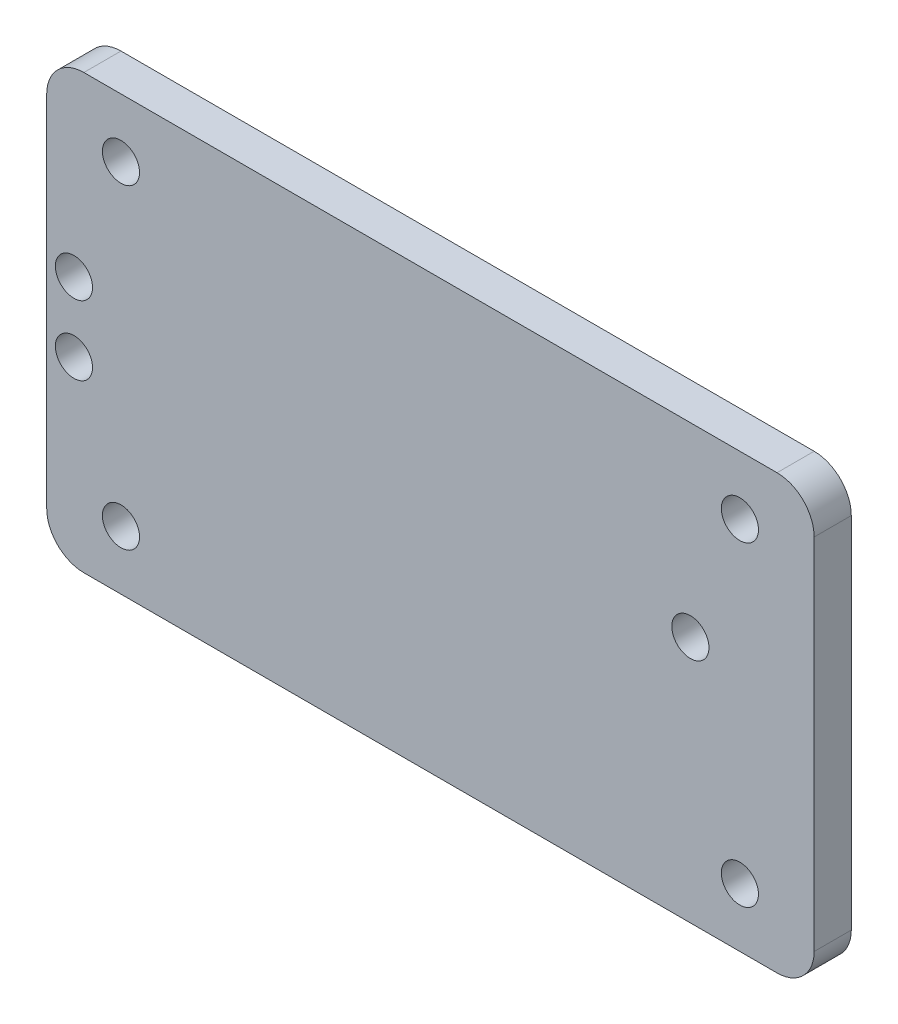
ISO-10303-21;
HEADER;
FILE_DESCRIPTION(('STEP AP214'),'2;1');
FILE_NAME('part.step','',(''),(''),'','','');
FILE_SCHEMA(('AUTOMOTIVE_DESIGN { 1 0 10303 214 1 1 1 1 }'));
ENDSEC;
DATA;
#1=APPLICATION_CONTEXT('core data for automotive mechanical design processes');
#2=APPLICATION_PROTOCOL_DEFINITION('international standard','automotive_design',2000,#1);
#3=PRODUCT_CONTEXT('',#1,'mechanical');
#4=PRODUCT('Part','Part','',(#3));
#5=PRODUCT_RELATED_PRODUCT_CATEGORY('part','',(#4));
#6=PRODUCT_DEFINITION_FORMATION('','',#4);
#7=PRODUCT_DEFINITION_CONTEXT('part definition',#1,'design');
#8=PRODUCT_DEFINITION('design','',#6,#7);
#9=PRODUCT_DEFINITION_SHAPE('','',#8);
#10=(LENGTH_UNIT() NAMED_UNIT(*) SI_UNIT(.MILLI.,.METRE.));
#11=(NAMED_UNIT(*) PLANE_ANGLE_UNIT() SI_UNIT($,.RADIAN.));
#12=(NAMED_UNIT(*) SI_UNIT($,.STERADIAN.) SOLID_ANGLE_UNIT());
#13=UNCERTAINTY_MEASURE_WITH_UNIT(LENGTH_MEASURE(1.E-05),#10,'distance_accuracy_value','');
#14=(GEOMETRIC_REPRESENTATION_CONTEXT(3) GLOBAL_UNCERTAINTY_ASSIGNED_CONTEXT((#13)) GLOBAL_UNIT_ASSIGNED_CONTEXT((#10,
#11,#12)) REPRESENTATION_CONTEXT('',''));
#15=CARTESIAN_POINT('',(0.,0.,0.));
#16=DIRECTION('',(0.,0.,1.));
#17=DIRECTION('',(1.,0.,0.));
#18=AXIS2_PLACEMENT_3D('',#15,#16,#17);
#19=CARTESIAN_POINT('',(28.,-14.5,3.));
#20=DIRECTION('',(0.,0.,1.));
#21=DIRECTION('',(1.,0.,0.));
#22=AXIS2_PLACEMENT_3D('',#19,#20,#21);
#23=PLANE('',#22);
#24=CARTESIAN_POINT('',(25.,-12.7500000000003,3.));
#25=DIRECTION('',(0.,0.,1.));
#26=DIRECTION('',(1.,0.,0.));
#27=AXIS2_PLACEMENT_3D('',#24,#25,#26);
#28=CIRCLE('',#27,1.5);
#29=CARTESIAN_POINT('',(26.5,-12.7500000000003,3.));
#30=VERTEX_POINT('',#29);
#31=EDGE_CURVE('E205',#30,#30,#28,.T.);
#32=ORIENTED_EDGE('',*,*,#31,.F.);
#33=EDGE_LOOP('',(#32));
#34=FACE_BOUND('',#33,.T.);
#35=CARTESIAN_POINT('',(-25.,12.7499999999997,3.));
#36=DIRECTION('',(0.,0.,1.));
#37=DIRECTION('',(1.,0.,0.));
#38=AXIS2_PLACEMENT_3D('',#35,#36,#37);
#39=CIRCLE('',#38,1.5);
#40=CARTESIAN_POINT('',(-23.5,12.7499999999997,3.));
#41=VERTEX_POINT('',#40);
#42=EDGE_CURVE('E193',#41,#41,#39,.T.);
#43=ORIENTED_EDGE('',*,*,#42,.F.);
#44=EDGE_LOOP('',(#43));
#45=FACE_BOUND('',#44,.T.);
#46=CARTESIAN_POINT('',(-28.8,-2.80000000000015,3.));
#47=DIRECTION('',(0.,0.,1.));
#48=DIRECTION('',(1.,0.,0.));
#49=AXIS2_PLACEMENT_3D('',#46,#47,#48);
#50=CIRCLE('',#49,1.5);
#51=CARTESIAN_POINT('',(-27.3,-2.80000000000015,3.));
#52=VERTEX_POINT('',#51);
#53=EDGE_CURVE('E181',#52,#52,#50,.T.);
#54=ORIENTED_EDGE('',*,*,#53,.F.);
#55=EDGE_LOOP('',(#54));
#56=FACE_BOUND('',#55,.T.);
#57=CARTESIAN_POINT('',(28.,-14.5,3.));
#58=DIRECTION('',(0.,0.,1.));
#59=DIRECTION('',(1.,0.,0.));
#60=AXIS2_PLACEMENT_3D('',#57,#58,#59);
#61=CIRCLE('',#60,3.);
#62=CARTESIAN_POINT('',(28.,-17.5,3.));
#63=VERTEX_POINT('',#62);
#64=CARTESIAN_POINT('',(31.,-14.5,3.));
#65=VERTEX_POINT('',#64);
#66=EDGE_CURVE('E144',#63,#65,#61,.T.);
#67=ORIENTED_EDGE('',*,*,#66,.T.);
#68=DIRECTION('',(0.,1.,0.));
#69=VECTOR('',#68,1.);
#70=CARTESIAN_POINT('',(31.,14.5,3.));
#71=LINE('',#70,#69);
#72=CARTESIAN_POINT('',(31.,14.5,3.));
#73=VERTEX_POINT('',#72);
#74=EDGE_CURVE('E92',#65,#73,#71,.T.);
#75=ORIENTED_EDGE('',*,*,#74,.T.);
#76=CARTESIAN_POINT('',(28.,14.5,3.));
#77=DIRECTION('',(0.,0.,1.));
#78=DIRECTION('',(-1.,0.,0.));
#79=AXIS2_PLACEMENT_3D('',#76,#77,#78);
#80=CIRCLE('',#79,3.);
#81=CARTESIAN_POINT('',(28.,17.5,3.));
#82=VERTEX_POINT('',#81);
#83=EDGE_CURVE('E159',#73,#82,#80,.T.);
#84=ORIENTED_EDGE('',*,*,#83,.T.);
#85=DIRECTION('',(-1.,0.,0.));
#86=VECTOR('',#85,1.);
#87=CARTESIAN_POINT('',(-28.,17.5,3.));
#88=LINE('',#87,#86);
#89=CARTESIAN_POINT('',(-28.,17.5,3.));
#90=VERTEX_POINT('',#89);
#91=EDGE_CURVE('E172',#82,#90,#88,.T.);
#92=ORIENTED_EDGE('',*,*,#91,.T.);
#93=CARTESIAN_POINT('',(-28.,14.5,3.));
#94=DIRECTION('',(0.,0.,1.));
#95=DIRECTION('',(1.,0.,0.));
#96=AXIS2_PLACEMENT_3D('',#93,#94,#95);
#97=CIRCLE('',#96,3.);
#98=CARTESIAN_POINT('',(-31.,14.5,3.));
#99=VERTEX_POINT('',#98);
#100=EDGE_CURVE('E111',#90,#99,#97,.T.);
#101=ORIENTED_EDGE('',*,*,#100,.T.);
#102=DIRECTION('',(0.,-1.,0.));
#103=VECTOR('',#102,1.);
#104=CARTESIAN_POINT('',(-31.,14.5,3.));
#105=LINE('',#104,#103);
#106=CARTESIAN_POINT('',(-31.,-14.5,3.));
#107=VERTEX_POINT('',#106);
#108=EDGE_CURVE('E105',#99,#107,#105,.T.);
#109=ORIENTED_EDGE('',*,*,#108,.T.);
#110=CARTESIAN_POINT('',(-28.,-14.5,3.));
#111=DIRECTION('',(0.,0.,1.));
#112=DIRECTION('',(1.,0.,0.));
#113=AXIS2_PLACEMENT_3D('',#110,#111,#112);
#114=CIRCLE('',#113,3.);
#115=CARTESIAN_POINT('',(-28.,-17.5,3.));
#116=VERTEX_POINT('',#115);
#117=EDGE_CURVE('E109',#107,#116,#114,.T.);
#118=ORIENTED_EDGE('',*,*,#117,.T.);
#119=DIRECTION('',(1.,0.,0.));
#120=VECTOR('',#119,1.);
#121=CARTESIAN_POINT('',(-28.,-17.5,3.));
#122=LINE('',#121,#120);
#123=EDGE_CURVE('E49',#116,#63,#122,.T.);
#124=ORIENTED_EDGE('',*,*,#123,.T.);
#125=EDGE_LOOP('',(#67,#75,#84,#92,#101,#109,#118,#124));
#126=FACE_BOUND('',#125,.T.);
#127=CARTESIAN_POINT('',(-28.8,2.79999999999985,3.));
#128=DIRECTION('',(0.,0.,1.));
#129=DIRECTION('',(1.,0.,0.));
#130=AXIS2_PLACEMENT_3D('',#127,#128,#129);
#131=CIRCLE('',#130,1.5);
#132=CARTESIAN_POINT('',(-27.3,2.79999999999985,3.));
#133=VERTEX_POINT('',#132);
#134=EDGE_CURVE('E133',#133,#133,#131,.T.);
#135=ORIENTED_EDGE('',*,*,#134,.F.);
#136=EDGE_LOOP('',(#135));
#137=FACE_BOUND('',#136,.T.);
#138=CARTESIAN_POINT('',(21.,2.49999999999985,3.));
#139=DIRECTION('',(0.,0.,1.));
#140=DIRECTION('',(1.,0.,0.));
#141=AXIS2_PLACEMENT_3D('',#138,#139,#140);
#142=CIRCLE('',#141,1.5);
#143=CARTESIAN_POINT('',(22.5,2.49999999999985,3.));
#144=VERTEX_POINT('',#143);
#145=EDGE_CURVE('E187',#144,#144,#142,.T.);
#146=ORIENTED_EDGE('',*,*,#145,.F.);
#147=EDGE_LOOP('',(#146));
#148=FACE_BOUND('',#147,.T.);
#149=CARTESIAN_POINT('',(25.,12.7499999999997,3.));
#150=DIRECTION('',(0.,0.,1.));
#151=DIRECTION('',(1.,0.,0.));
#152=AXIS2_PLACEMENT_3D('',#149,#150,#151);
#153=CIRCLE('',#152,1.5);
#154=CARTESIAN_POINT('',(26.5,12.7499999999997,3.));
#155=VERTEX_POINT('',#154);
#156=EDGE_CURVE('E199',#155,#155,#153,.T.);
#157=ORIENTED_EDGE('',*,*,#156,.F.);
#158=EDGE_LOOP('',(#157));
#159=FACE_BOUND('',#158,.T.);
#160=CARTESIAN_POINT('',(-25.,-12.7500000000003,3.));
#161=DIRECTION('',(0.,0.,1.));
#162=DIRECTION('',(1.,0.,0.));
#163=AXIS2_PLACEMENT_3D('',#160,#161,#162);
#164=CIRCLE('',#163,1.5);
#165=CARTESIAN_POINT('',(-23.5,-12.7500000000003,3.));
#166=VERTEX_POINT('',#165);
#167=EDGE_CURVE('E211',#166,#166,#164,.T.);
#168=ORIENTED_EDGE('',*,*,#167,.F.);
#169=EDGE_LOOP('',(#168));
#170=FACE_BOUND('',#169,.T.);
#171=ADVANCED_FACE('F32',(#34,#45,#56,#126,#137,#148,#159,#170),#23,.T.);
#172=CARTESIAN_POINT('',(28.,-14.5,0.));
#173=DIRECTION('',(0.,0.,1.));
#174=DIRECTION('',(1.,0.,0.));
#175=AXIS2_PLACEMENT_3D('',#172,#173,#174);
#176=PLANE('',#175);
#177=CARTESIAN_POINT('',(28.,-14.5,0.));
#178=DIRECTION('',(0.,0.,1.));
#179=DIRECTION('',(1.,0.,0.));
#180=AXIS2_PLACEMENT_3D('',#177,#178,#179);
#181=CIRCLE('',#180,3.);
#182=CARTESIAN_POINT('',(28.,-17.5,0.));
#183=VERTEX_POINT('',#182);
#184=CARTESIAN_POINT('',(31.,-14.5,0.));
#185=VERTEX_POINT('',#184);
#186=EDGE_CURVE('E129',#183,#185,#181,.T.);
#187=ORIENTED_EDGE('',*,*,#186,.F.);
#188=DIRECTION('',(1.,0.,0.));
#189=VECTOR('',#188,1.);
#190=CARTESIAN_POINT('',(-28.,-17.5,0.));
#191=LINE('',#190,#189);
#192=CARTESIAN_POINT('',(-28.,-17.5,0.));
#193=VERTEX_POINT('',#192);
#194=EDGE_CURVE('E84',#193,#183,#191,.T.);
#195=ORIENTED_EDGE('',*,*,#194,.F.);
#196=CARTESIAN_POINT('',(-28.,-14.5,0.));
#197=DIRECTION('',(0.,0.,1.));
#198=DIRECTION('',(1.,0.,0.));
#199=AXIS2_PLACEMENT_3D('',#196,#197,#198);
#200=CIRCLE('',#199,3.);
#201=CARTESIAN_POINT('',(-31.,-14.5,0.));
#202=VERTEX_POINT('',#201);
#203=EDGE_CURVE('E78',#202,#193,#200,.T.);
#204=ORIENTED_EDGE('',*,*,#203,.F.);
#205=DIRECTION('',(0.,-1.,0.));
#206=VECTOR('',#205,1.);
#207=CARTESIAN_POINT('',(-31.,14.5,0.));
#208=LINE('',#207,#206);
#209=CARTESIAN_POINT('',(-31.,14.5,0.));
#210=VERTEX_POINT('',#209);
#211=EDGE_CURVE('E119',#210,#202,#208,.T.);
#212=ORIENTED_EDGE('',*,*,#211,.F.);
#213=CARTESIAN_POINT('',(-28.,14.5,0.));
#214=DIRECTION('',(0.,0.,1.));
#215=DIRECTION('',(1.,0.,0.));
#216=AXIS2_PLACEMENT_3D('',#213,#214,#215);
#217=CIRCLE('',#216,3.);
#218=CARTESIAN_POINT('',(-28.,17.5,0.));
#219=VERTEX_POINT('',#218);
#220=EDGE_CURVE('E139',#219,#210,#217,.T.);
#221=ORIENTED_EDGE('',*,*,#220,.F.);
#222=DIRECTION('',(-1.,0.,0.));
#223=VECTOR('',#222,1.);
#224=CARTESIAN_POINT('',(-28.,17.5,0.));
#225=LINE('',#224,#223);
#226=CARTESIAN_POINT('',(28.,17.5,0.));
#227=VERTEX_POINT('',#226);
#228=EDGE_CURVE('E137',#227,#219,#225,.T.);
#229=ORIENTED_EDGE('',*,*,#228,.F.);
#230=CARTESIAN_POINT('',(28.,14.5,0.));
#231=DIRECTION('',(0.,0.,1.));
#232=DIRECTION('',(-1.,0.,0.));
#233=AXIS2_PLACEMENT_3D('',#230,#231,#232);
#234=CIRCLE('',#233,3.);
#235=CARTESIAN_POINT('',(31.,14.5,0.));
#236=VERTEX_POINT('',#235);
#237=EDGE_CURVE('E135',#236,#227,#234,.T.);
#238=ORIENTED_EDGE('',*,*,#237,.F.);
#239=DIRECTION('',(0.,1.,0.));
#240=VECTOR('',#239,1.);
#241=CARTESIAN_POINT('',(31.,14.5,0.));
#242=LINE('',#241,#240);
#243=EDGE_CURVE('E132',#185,#236,#242,.T.);
#244=ORIENTED_EDGE('',*,*,#243,.F.);
#245=EDGE_LOOP('',(#187,#195,#204,#212,#221,#229,#238,#244));
#246=FACE_BOUND('',#245,.T.);
#247=CARTESIAN_POINT('',(-28.8,2.79999999999985,0.));
#248=DIRECTION('',(0.,0.,1.));
#249=DIRECTION('',(1.,0.,0.));
#250=AXIS2_PLACEMENT_3D('',#247,#248,#249);
#251=CIRCLE('',#250,1.5);
#252=CARTESIAN_POINT('',(-27.3,2.79999999999985,0.));
#253=VERTEX_POINT('',#252);
#254=EDGE_CURVE('E178',#253,#253,#251,.T.);
#255=ORIENTED_EDGE('',*,*,#254,.T.);
#256=EDGE_LOOP('',(#255));
#257=FACE_BOUND('',#256,.T.);
#258=CARTESIAN_POINT('',(-28.8,-2.80000000000015,0.));
#259=DIRECTION('',(0.,0.,1.));
#260=DIRECTION('',(1.,0.,0.));
#261=AXIS2_PLACEMENT_3D('',#258,#259,#260);
#262=CIRCLE('',#261,1.5);
#263=CARTESIAN_POINT('',(-27.3,-2.80000000000015,0.));
#264=VERTEX_POINT('',#263);
#265=EDGE_CURVE('E184',#264,#264,#262,.T.);
#266=ORIENTED_EDGE('',*,*,#265,.T.);
#267=EDGE_LOOP('',(#266));
#268=FACE_BOUND('',#267,.T.);
#269=CARTESIAN_POINT('',(21.,2.49999999999985,0.));
#270=DIRECTION('',(0.,0.,1.));
#271=DIRECTION('',(1.,0.,0.));
#272=AXIS2_PLACEMENT_3D('',#269,#270,#271);
#273=CIRCLE('',#272,1.5);
#274=CARTESIAN_POINT('',(22.5,2.49999999999985,0.));
#275=VERTEX_POINT('',#274);
#276=EDGE_CURVE('E190',#275,#275,#273,.T.);
#277=ORIENTED_EDGE('',*,*,#276,.T.);
#278=EDGE_LOOP('',(#277));
#279=FACE_BOUND('',#278,.T.);
#280=CARTESIAN_POINT('',(-25.,12.7499999999997,0.));
#281=DIRECTION('',(0.,0.,1.));
#282=DIRECTION('',(1.,0.,0.));
#283=AXIS2_PLACEMENT_3D('',#280,#281,#282);
#284=CIRCLE('',#283,1.5);
#285=CARTESIAN_POINT('',(-23.5,12.7499999999997,0.));
#286=VERTEX_POINT('',#285);
#287=EDGE_CURVE('E196',#286,#286,#284,.T.);
#288=ORIENTED_EDGE('',*,*,#287,.T.);
#289=EDGE_LOOP('',(#288));
#290=FACE_BOUND('',#289,.T.);
#291=CARTESIAN_POINT('',(25.,12.7499999999997,0.));
#292=DIRECTION('',(0.,0.,1.));
#293=DIRECTION('',(1.,0.,0.));
#294=AXIS2_PLACEMENT_3D('',#291,#292,#293);
#295=CIRCLE('',#294,1.5);
#296=CARTESIAN_POINT('',(26.5,12.7499999999997,0.));
#297=VERTEX_POINT('',#296);
#298=EDGE_CURVE('E202',#297,#297,#295,.T.);
#299=ORIENTED_EDGE('',*,*,#298,.T.);
#300=EDGE_LOOP('',(#299));
#301=FACE_BOUND('',#300,.T.);
#302=CARTESIAN_POINT('',(25.,-12.7500000000003,0.));
#303=DIRECTION('',(0.,0.,1.));
#304=DIRECTION('',(1.,0.,0.));
#305=AXIS2_PLACEMENT_3D('',#302,#303,#304);
#306=CIRCLE('',#305,1.5);
#307=CARTESIAN_POINT('',(26.5,-12.7500000000003,0.));
#308=VERTEX_POINT('',#307);
#309=EDGE_CURVE('E208',#308,#308,#306,.T.);
#310=ORIENTED_EDGE('',*,*,#309,.T.);
#311=EDGE_LOOP('',(#310));
#312=FACE_BOUND('',#311,.T.);
#313=CARTESIAN_POINT('',(-25.,-12.7500000000003,0.));
#314=DIRECTION('',(0.,0.,1.));
#315=DIRECTION('',(1.,0.,0.));
#316=AXIS2_PLACEMENT_3D('',#313,#314,#315);
#317=CIRCLE('',#316,1.5);
#318=CARTESIAN_POINT('',(-23.5,-12.7500000000003,0.));
#319=VERTEX_POINT('',#318);
#320=EDGE_CURVE('E214',#319,#319,#317,.T.);
#321=ORIENTED_EDGE('',*,*,#320,.T.);
#322=EDGE_LOOP('',(#321));
#323=FACE_BOUND('',#322,.T.);
#324=ADVANCED_FACE('F163',(#246,#257,#268,#279,#290,#301,#312,#323),#176,.F.);
#325=CARTESIAN_POINT('',(28.,-14.5,3.));
#326=DIRECTION('',(0.,0.,-1.));
#327=DIRECTION('',(-1.,0.,0.));
#328=AXIS2_PLACEMENT_3D('',#325,#326,#327);
#329=CYLINDRICAL_SURFACE('',#328,3.);
#330=ORIENTED_EDGE('',*,*,#186,.T.);
#331=DIRECTION('',(0.,0.,-1.));
#332=VECTOR('',#331,1.);
#333=CARTESIAN_POINT('',(31.,-14.5,3.));
#334=LINE('',#333,#332);
#335=EDGE_CURVE('E11',#65,#185,#334,.T.);
#336=ORIENTED_EDGE('',*,*,#335,.F.);
#337=ORIENTED_EDGE('',*,*,#66,.F.);
#338=DIRECTION('',(0.,0.,-1.));
#339=VECTOR('',#338,1.);
#340=CARTESIAN_POINT('',(28.,-17.5,3.));
#341=LINE('',#340,#339);
#342=EDGE_CURVE('E125',#63,#183,#341,.T.);
#343=ORIENTED_EDGE('',*,*,#342,.T.);
#344=EDGE_LOOP('',(#330,#336,#337,#343));
#345=FACE_BOUND('',#344,.T.);
#346=ADVANCED_FACE('F34',(#345),#329,.T.);
#347=CARTESIAN_POINT('',(31.,14.5,3.));
#348=DIRECTION('',(-1.,0.,0.));
#349=DIRECTION('',(0.,0.,1.));
#350=AXIS2_PLACEMENT_3D('',#347,#348,#349);
#351=PLANE('',#350);
#352=ORIENTED_EDGE('',*,*,#243,.T.);
#353=DIRECTION('',(0.,0.,-1.));
#354=VECTOR('',#353,1.);
#355=CARTESIAN_POINT('',(31.,14.5,3.));
#356=LINE('',#355,#354);
#357=EDGE_CURVE('E41',#73,#236,#356,.T.);
#358=ORIENTED_EDGE('',*,*,#357,.F.);
#359=ORIENTED_EDGE('',*,*,#74,.F.);
#360=ORIENTED_EDGE('',*,*,#335,.T.);
#361=EDGE_LOOP('',(#352,#358,#359,#360));
#362=FACE_BOUND('',#361,.T.);
#363=ADVANCED_FACE('F248',(#362),#351,.F.);
#364=CARTESIAN_POINT('',(28.,14.5,3.));
#365=DIRECTION('',(0.,0.,-1.));
#366=DIRECTION('',(-1.,0.,0.));
#367=AXIS2_PLACEMENT_3D('',#364,#365,#366);
#368=CYLINDRICAL_SURFACE('',#367,3.);
#369=ORIENTED_EDGE('',*,*,#237,.T.);
#370=DIRECTION('',(0.,0.,-1.));
#371=VECTOR('',#370,1.);
#372=CARTESIAN_POINT('',(28.,17.5,3.));
#373=LINE('',#372,#371);
#374=EDGE_CURVE('E151',#82,#227,#373,.T.);
#375=ORIENTED_EDGE('',*,*,#374,.F.);
#376=ORIENTED_EDGE('',*,*,#83,.F.);
#377=ORIENTED_EDGE('',*,*,#357,.T.);
#378=EDGE_LOOP('',(#369,#375,#376,#377));
#379=FACE_BOUND('',#378,.T.);
#380=ADVANCED_FACE('F157',(#379),#368,.T.);
#381=CARTESIAN_POINT('',(-28.,17.5,3.));
#382=DIRECTION('',(0.,-1.,0.));
#383=DIRECTION('',(0.,0.,-1.));
#384=AXIS2_PLACEMENT_3D('',#381,#382,#383);
#385=PLANE('',#384);
#386=ORIENTED_EDGE('',*,*,#228,.T.);
#387=DIRECTION('',(0.,0.,-1.));
#388=VECTOR('',#387,1.);
#389=CARTESIAN_POINT('',(-28.,17.5,3.));
#390=LINE('',#389,#388);
#391=EDGE_CURVE('E148',#90,#219,#390,.T.);
#392=ORIENTED_EDGE('',*,*,#391,.F.);
#393=ORIENTED_EDGE('',*,*,#91,.F.);
#394=ORIENTED_EDGE('',*,*,#374,.T.);
#395=EDGE_LOOP('',(#386,#392,#393,#394));
#396=FACE_BOUND('',#395,.T.);
#397=ADVANCED_FACE('F168',(#396),#385,.F.);
#398=CARTESIAN_POINT('',(-28.,14.5,3.));
#399=DIRECTION('',(0.,0.,-1.));
#400=DIRECTION('',(-1.,0.,0.));
#401=AXIS2_PLACEMENT_3D('',#398,#399,#400);
#402=CYLINDRICAL_SURFACE('',#401,3.);
#403=ORIENTED_EDGE('',*,*,#220,.T.);
#404=DIRECTION('',(0.,0.,-1.));
#405=VECTOR('',#404,1.);
#406=CARTESIAN_POINT('',(-31.,14.5,3.));
#407=LINE('',#406,#405);
#408=EDGE_CURVE('E120',#99,#210,#407,.T.);
#409=ORIENTED_EDGE('',*,*,#408,.F.);
#410=ORIENTED_EDGE('',*,*,#100,.F.);
#411=ORIENTED_EDGE('',*,*,#391,.T.);
#412=EDGE_LOOP('',(#403,#409,#410,#411));
#413=FACE_BOUND('',#412,.T.);
#414=ADVANCED_FACE('F171',(#413),#402,.T.);
#415=CARTESIAN_POINT('',(-31.,14.5,3.));
#416=DIRECTION('',(1.,0.,0.));
#417=DIRECTION('',(0.,0.,-1.));
#418=AXIS2_PLACEMENT_3D('',#415,#416,#417);
#419=PLANE('',#418);
#420=ORIENTED_EDGE('',*,*,#211,.T.);
#421=DIRECTION('',(0.,0.,-1.));
#422=VECTOR('',#421,1.);
#423=CARTESIAN_POINT('',(-31.,-14.5,3.));
#424=LINE('',#423,#422);
#425=EDGE_CURVE('E116',#107,#202,#424,.T.);
#426=ORIENTED_EDGE('',*,*,#425,.F.);
#427=ORIENTED_EDGE('',*,*,#108,.F.);
#428=ORIENTED_EDGE('',*,*,#408,.T.);
#429=EDGE_LOOP('',(#420,#426,#427,#428));
#430=FACE_BOUND('',#429,.T.);
#431=ADVANCED_FACE('F117',(#430),#419,.F.);
#432=CARTESIAN_POINT('',(-28.,-14.5,3.));
#433=DIRECTION('',(0.,0.,-1.));
#434=DIRECTION('',(-1.,0.,0.));
#435=AXIS2_PLACEMENT_3D('',#432,#433,#434);
#436=CYLINDRICAL_SURFACE('',#435,3.);
#437=ORIENTED_EDGE('',*,*,#203,.T.);
#438=DIRECTION('',(0.,0.,-1.));
#439=VECTOR('',#438,1.);
#440=CARTESIAN_POINT('',(-28.,-17.5,3.));
#441=LINE('',#440,#439);
#442=EDGE_CURVE('E121',#116,#193,#441,.T.);
#443=ORIENTED_EDGE('',*,*,#442,.F.);
#444=ORIENTED_EDGE('',*,*,#117,.F.);
#445=ORIENTED_EDGE('',*,*,#425,.T.);
#446=EDGE_LOOP('',(#437,#443,#444,#445));
#447=FACE_BOUND('',#446,.T.);
#448=ADVANCED_FACE('F123',(#447),#436,.T.);
#449=CARTESIAN_POINT('',(-28.,-17.5,3.));
#450=DIRECTION('',(0.,1.,0.));
#451=DIRECTION('',(0.,0.,1.));
#452=AXIS2_PLACEMENT_3D('',#449,#450,#451);
#453=PLANE('',#452);
#454=ORIENTED_EDGE('',*,*,#194,.T.);
#455=ORIENTED_EDGE('',*,*,#342,.F.);
#456=ORIENTED_EDGE('',*,*,#123,.F.);
#457=ORIENTED_EDGE('',*,*,#442,.T.);
#458=EDGE_LOOP('',(#454,#455,#456,#457));
#459=FACE_BOUND('',#458,.T.);
#460=ADVANCED_FACE('F236',(#459),#453,.F.);
#461=CARTESIAN_POINT('',(-28.8,2.79999999999985,3.));
#462=DIRECTION('',(0.,0.,-1.));
#463=DIRECTION('',(-1.,0.,0.));
#464=AXIS2_PLACEMENT_3D('',#461,#462,#463);
#465=CYLINDRICAL_SURFACE('',#464,1.5);
#466=ORIENTED_EDGE('',*,*,#134,.T.);
#467=EDGE_LOOP('',(#466));
#468=FACE_BOUND('',#467,.T.);
#469=ORIENTED_EDGE('',*,*,#254,.F.);
#470=EDGE_LOOP('',(#469));
#471=FACE_BOUND('',#470,.T.);
#472=ADVANCED_FACE('F233',(#468,#471),#465,.F.);
#473=CARTESIAN_POINT('',(-28.8,-2.80000000000015,3.));
#474=DIRECTION('',(0.,0.,-1.));
#475=DIRECTION('',(-1.,0.,0.));
#476=AXIS2_PLACEMENT_3D('',#473,#474,#475);
#477=CYLINDRICAL_SURFACE('',#476,1.5);
#478=ORIENTED_EDGE('',*,*,#53,.T.);
#479=EDGE_LOOP('',(#478));
#480=FACE_BOUND('',#479,.T.);
#481=ORIENTED_EDGE('',*,*,#265,.F.);
#482=EDGE_LOOP('',(#481));
#483=FACE_BOUND('',#482,.T.);
#484=ADVANCED_FACE('F312',(#480,#483),#477,.F.);
#485=CARTESIAN_POINT('',(21.,2.49999999999985,3.));
#486=DIRECTION('',(0.,0.,-1.));
#487=DIRECTION('',(-1.,0.,0.));
#488=AXIS2_PLACEMENT_3D('',#485,#486,#487);
#489=CYLINDRICAL_SURFACE('',#488,1.5);
#490=ORIENTED_EDGE('',*,*,#145,.T.);
#491=EDGE_LOOP('',(#490));
#492=FACE_BOUND('',#491,.T.);
#493=ORIENTED_EDGE('',*,*,#276,.F.);
#494=EDGE_LOOP('',(#493));
#495=FACE_BOUND('',#494,.T.);
#496=ADVANCED_FACE('F320',(#492,#495),#489,.F.);
#497=CARTESIAN_POINT('',(-25.,12.7499999999997,3.));
#498=DIRECTION('',(0.,0.,-1.));
#499=DIRECTION('',(-1.,0.,0.));
#500=AXIS2_PLACEMENT_3D('',#497,#498,#499);
#501=CYLINDRICAL_SURFACE('',#500,1.5);
#502=ORIENTED_EDGE('',*,*,#42,.T.);
#503=EDGE_LOOP('',(#502));
#504=FACE_BOUND('',#503,.T.);
#505=ORIENTED_EDGE('',*,*,#287,.F.);
#506=EDGE_LOOP('',(#505));
#507=FACE_BOUND('',#506,.T.);
#508=ADVANCED_FACE('F328',(#504,#507),#501,.F.);
#509=CARTESIAN_POINT('',(25.,12.7499999999997,3.));
#510=DIRECTION('',(0.,0.,-1.));
#511=DIRECTION('',(-1.,0.,0.));
#512=AXIS2_PLACEMENT_3D('',#509,#510,#511);
#513=CYLINDRICAL_SURFACE('',#512,1.5);
#514=ORIENTED_EDGE('',*,*,#156,.T.);
#515=EDGE_LOOP('',(#514));
#516=FACE_BOUND('',#515,.T.);
#517=ORIENTED_EDGE('',*,*,#298,.F.);
#518=EDGE_LOOP('',(#517));
#519=FACE_BOUND('',#518,.T.);
#520=ADVANCED_FACE('F337',(#516,#519),#513,.F.);
#521=CARTESIAN_POINT('',(25.,-12.7500000000003,3.));
#522=DIRECTION('',(0.,0.,-1.));
#523=DIRECTION('',(-1.,0.,0.));
#524=AXIS2_PLACEMENT_3D('',#521,#522,#523);
#525=CYLINDRICAL_SURFACE('',#524,1.5);
#526=ORIENTED_EDGE('',*,*,#31,.T.);
#527=EDGE_LOOP('',(#526));
#528=FACE_BOUND('',#527,.T.);
#529=ORIENTED_EDGE('',*,*,#309,.F.);
#530=EDGE_LOOP('',(#529));
#531=FACE_BOUND('',#530,.T.);
#532=ADVANCED_FACE('F346',(#528,#531),#525,.F.);
#533=CARTESIAN_POINT('',(-25.,-12.7500000000003,3.));
#534=DIRECTION('',(0.,0.,-1.));
#535=DIRECTION('',(-1.,0.,0.));
#536=AXIS2_PLACEMENT_3D('',#533,#534,#535);
#537=CYLINDRICAL_SURFACE('',#536,1.5);
#538=ORIENTED_EDGE('',*,*,#167,.T.);
#539=EDGE_LOOP('',(#538));
#540=FACE_BOUND('',#539,.T.);
#541=ORIENTED_EDGE('',*,*,#320,.F.);
#542=EDGE_LOOP('',(#541));
#543=FACE_BOUND('',#542,.T.);
#544=ADVANCED_FACE('F220',(#540,#543),#537,.F.);
#545=CLOSED_SHELL('',(#171,#324,#346,#363,#380,#397,#414,#431,#448,#460,#472,#484,#496,#508,
#520,#532,#544));
#546=MANIFOLD_SOLID_BREP('B2',#545);
#547=ADVANCED_BREP_SHAPE_REPRESENTATION('',(#18,#546),#14);
#548=SHAPE_DEFINITION_REPRESENTATION(#9,#547);
ENDSEC;
END-ISO-10303-21;
